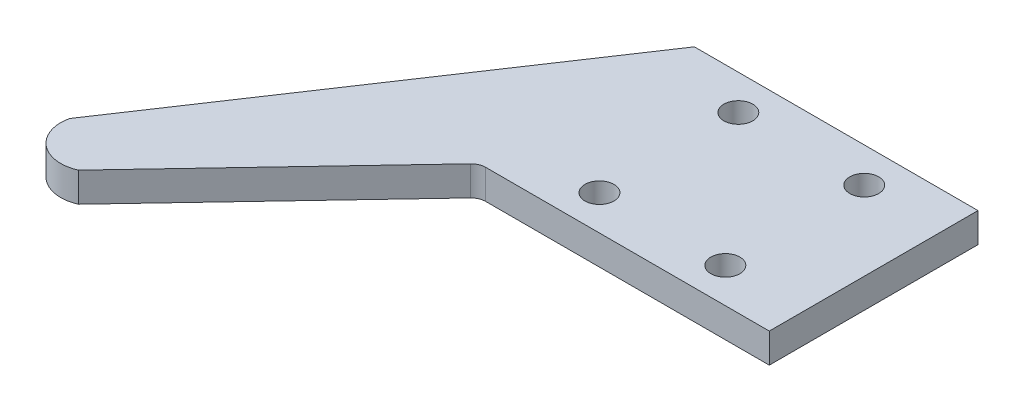
ISO-10303-21;
HEADER;
FILE_DESCRIPTION(('STEP AP214'),'2;1');
FILE_NAME('part.step','',(''),(''),'','','');
FILE_SCHEMA(('AUTOMOTIVE_DESIGN { 1 0 10303 214 1 1 1 1 }'));
ENDSEC;
DATA;
#1=APPLICATION_CONTEXT('core data for automotive mechanical design processes');
#2=APPLICATION_PROTOCOL_DEFINITION('international standard','automotive_design',2000,#1);
#3=PRODUCT_CONTEXT('',#1,'mechanical');
#4=PRODUCT('Part','Part','',(#3));
#5=PRODUCT_RELATED_PRODUCT_CATEGORY('part','',(#4));
#6=PRODUCT_DEFINITION_FORMATION('','',#4);
#7=PRODUCT_DEFINITION_CONTEXT('part definition',#1,'design');
#8=PRODUCT_DEFINITION('design','',#6,#7);
#9=PRODUCT_DEFINITION_SHAPE('','',#8);
#10=(LENGTH_UNIT() NAMED_UNIT(*) SI_UNIT(.MILLI.,.METRE.));
#11=(NAMED_UNIT(*) PLANE_ANGLE_UNIT() SI_UNIT($,.RADIAN.));
#12=(NAMED_UNIT(*) SI_UNIT($,.STERADIAN.) SOLID_ANGLE_UNIT());
#13=UNCERTAINTY_MEASURE_WITH_UNIT(LENGTH_MEASURE(1.E-05),#10,'distance_accuracy_value','');
#14=(GEOMETRIC_REPRESENTATION_CONTEXT(3) GLOBAL_UNCERTAINTY_ASSIGNED_CONTEXT((#13)) GLOBAL_UNIT_ASSIGNED_CONTEXT((#10,
#11,#12)) REPRESENTATION_CONTEXT('',''));
#15=CARTESIAN_POINT('',(0.,0.,0.));
#16=DIRECTION('',(0.,0.,1.));
#17=DIRECTION('',(1.,0.,0.));
#18=AXIS2_PLACEMENT_3D('',#15,#16,#17);
#19=CARTESIAN_POINT('',(29.0805616574897,5.08,41.9679460883035));
#20=DIRECTION('',(0.,-1.,0.));
#21=DIRECTION('',(0.,0.,-1.));
#22=AXIS2_PLACEMENT_3D('',#19,#20,#21);
#23=PLANE('',#22);
#24=CARTESIAN_POINT('',(64.2762166698085,5.08,9.55119608830347));
#25=DIRECTION('',(0.,1.,0.));
#26=DIRECTION('',(0.,0.,1.));
#27=AXIS2_PLACEMENT_3D('',#24,#25,#26);
#28=CIRCLE('',#27,2.48919999999998);
#29=CARTESIAN_POINT('',(64.2762166698085,5.08,12.0403960883035));
#30=VERTEX_POINT('',#29);
#31=EDGE_CURVE('E206',#30,#30,#28,.T.);
#32=ORIENTED_EDGE('',*,*,#31,.F.);
#33=EDGE_LOOP('',(#32));
#34=FACE_BOUND('',#33,.T.);
#35=CARTESIAN_POINT('',(64.2762166698085,5.08,33.4271960883035));
#36=DIRECTION('',(0.,1.,0.));
#37=DIRECTION('',(0.,0.,1.));
#38=AXIS2_PLACEMENT_3D('',#35,#36,#37);
#39=CIRCLE('',#38,2.48919999999998);
#40=CARTESIAN_POINT('',(64.2762166698085,5.08,35.9163960883035));
#41=VERTEX_POINT('',#40);
#42=EDGE_CURVE('E198',#41,#41,#39,.T.);
#43=ORIENTED_EDGE('',*,*,#42,.F.);
#44=EDGE_LOOP('',(#43));
#45=FACE_BOUND('',#44,.T.);
#46=CARTESIAN_POINT('',(29.0805616574897,5.08,41.9679460883035));
#47=DIRECTION('',(0.,-1.,0.));
#48=DIRECTION('',(0.,0.,-1.));
#49=AXIS2_PLACEMENT_3D('',#46,#47,#48);
#50=CIRCLE('',#49,2.54);
#51=CARTESIAN_POINT('',(27.2348076709543,5.08,40.2230127883781));
#52=VERTEX_POINT('',#51);
#53=CARTESIAN_POINT('',(29.0805616574897,5.08,39.4279460883035));
#54=VERTEX_POINT('',#53);
#55=EDGE_CURVE('E160',#52,#54,#50,.T.);
#56=ORIENTED_EDGE('',*,*,#55,.T.);
#57=DIRECTION('',(1.,0.,0.));
#58=VECTOR('',#57,1.);
#59=CARTESIAN_POINT('',(77.8310716821274,5.08,39.4279460883035));
#60=LINE('',#59,#58);
#61=CARTESIAN_POINT('',(77.8310716821274,5.08,39.4279460883035));
#62=VERTEX_POINT('',#61);
#63=EDGE_CURVE('E101',#54,#62,#60,.T.);
#64=ORIENTED_EDGE('',*,*,#63,.T.);
#65=DIRECTION('',(0.,0.,-1.));
#66=VECTOR('',#65,1.);
#67=CARTESIAN_POINT('',(77.8310716821274,5.08,3.55044608830348));
#68=LINE('',#67,#66);
#69=CARTESIAN_POINT('',(77.8310716821274,5.08,3.55044608830348));
#70=VERTEX_POINT('',#69);
#71=EDGE_CURVE('E178',#62,#70,#68,.T.);
#72=ORIENTED_EDGE('',*,*,#71,.T.);
#73=DIRECTION('',(-1.,0.,0.));
#74=VECTOR('',#73,1.);
#75=CARTESIAN_POINT('',(77.8310716821274,5.08,3.55044608830348));
#76=LINE('',#75,#74);
#77=CARTESIAN_POINT('',(29.0805616574897,5.08,3.55044608830346));
#78=VERTEX_POINT('',#77);
#79=EDGE_CURVE('E117',#70,#78,#76,.T.);
#80=ORIENTED_EDGE('',*,*,#79,.T.);
#81=DIRECTION('',(-0.555738142747448,0.,0.831357394082483));
#82=VECTOR('',#81,1.);
#83=CARTESIAN_POINT('',(29.0805616574897,5.08,3.55044608830346));
#84=LINE('',#83,#82);
#85=CARTESIAN_POINT('',(-13.9430810740264,5.08,67.9117356128622));
#86=VERTEX_POINT('',#85);
#87=EDGE_CURVE('E111',#78,#86,#84,.T.);
#88=ORIENTED_EDGE('',*,*,#87,.T.);
#89=CARTESIAN_POINT('',(-8.02603322877602,5.08,69.3087227378112));
#90=DIRECTION('',(0.,1.,0.));
#91=DIRECTION('',(0.,0.,-1.));
#92=AXIS2_PLACEMENT_3D('',#89,#90,#91);
#93=CIRCLE('',#92,6.07972270998076);
#94=CARTESIAN_POINT('',(-5.4826917026468,5.08,74.8309000359177));
#95=VERTEX_POINT('',#94);
#96=EDGE_CURVE('E115',#86,#95,#93,.T.);
#97=ORIENTED_EDGE('',*,*,#96,.T.);
#98=DIRECTION('',(0.686981614143855,0.,-0.7266747978486));
#99=VECTOR('',#98,1.);
#100=CARTESIAN_POINT('',(27.2348076709543,5.08,40.2230127883781));
#101=LINE('',#100,#99);
#102=EDGE_CURVE('E61',#95,#52,#101,.T.);
#103=ORIENTED_EDGE('',*,*,#102,.T.);
#104=EDGE_LOOP('',(#56,#64,#72,#80,#88,#97,#103));
#105=FACE_BOUND('',#104,.T.);
#106=CARTESIAN_POINT('',(42.6354166698085,5.08,9.55119608830348));
#107=DIRECTION('',(0.,1.,0.));
#108=DIRECTION('',(0.,0.,1.));
#109=AXIS2_PLACEMENT_3D('',#106,#107,#108);
#110=CIRCLE('',#109,2.48919999999999);
#111=CARTESIAN_POINT('',(42.6354166698085,5.08,12.0403960883035));
#112=VERTEX_POINT('',#111);
#113=EDGE_CURVE('E214',#112,#112,#110,.T.);
#114=ORIENTED_EDGE('',*,*,#113,.F.);
#115=EDGE_LOOP('',(#114));
#116=FACE_BOUND('',#115,.T.);
#117=CARTESIAN_POINT('',(42.6354166698085,5.08,33.4271960883035));
#118=DIRECTION('',(0.,1.,0.));
#119=DIRECTION('',(0.,0.,1.));
#120=AXIS2_PLACEMENT_3D('',#117,#118,#119);
#121=CIRCLE('',#120,2.48919999999999);
#122=CARTESIAN_POINT('',(42.6354166698085,5.08,35.9163960883035));
#123=VERTEX_POINT('',#122);
#124=EDGE_CURVE('E222',#123,#123,#121,.T.);
#125=ORIENTED_EDGE('',*,*,#124,.F.);
#126=EDGE_LOOP('',(#125));
#127=FACE_BOUND('',#126,.T.);
#128=ADVANCED_FACE('F43',(#34,#45,#105,#116,#127),#23,.F.);
#129=CARTESIAN_POINT('',(29.0805616574897,0.,41.9679460883035));
#130=DIRECTION('',(0.,-1.,0.));
#131=DIRECTION('',(0.,0.,-1.));
#132=AXIS2_PLACEMENT_3D('',#129,#130,#131);
#133=PLANE('',#132);
#134=CARTESIAN_POINT('',(42.6354166698085,0.,9.55119608830348));
#135=DIRECTION('',(0.,1.,0.));
#136=DIRECTION('',(0.,0.,1.));
#137=AXIS2_PLACEMENT_3D('',#134,#135,#136);
#138=CIRCLE('',#137,2.4892);
#139=CARTESIAN_POINT('',(42.6354166698085,0.,12.0403960883035));
#140=VERTEX_POINT('',#139);
#141=EDGE_CURVE('E210',#140,#140,#138,.T.);
#142=ORIENTED_EDGE('',*,*,#141,.T.);
#143=EDGE_LOOP('',(#142));
#144=FACE_BOUND('',#143,.T.);
#145=CARTESIAN_POINT('',(64.2762166698085,0.,9.55119608830347));
#146=DIRECTION('',(0.,1.,0.));
#147=DIRECTION('',(0.,0.,1.));
#148=AXIS2_PLACEMENT_3D('',#145,#146,#147);
#149=CIRCLE('',#148,2.4892);
#150=CARTESIAN_POINT('',(64.2762166698085,0.,12.0403960883035));
#151=VERTEX_POINT('',#150);
#152=EDGE_CURVE('E202',#151,#151,#149,.T.);
#153=ORIENTED_EDGE('',*,*,#152,.T.);
#154=EDGE_LOOP('',(#153));
#155=FACE_BOUND('',#154,.T.);
#156=CARTESIAN_POINT('',(64.2762166698085,0.,33.4271960883035));
#157=DIRECTION('',(0.,1.,0.));
#158=DIRECTION('',(0.,0.,1.));
#159=AXIS2_PLACEMENT_3D('',#156,#157,#158);
#160=CIRCLE('',#159,2.4892);
#161=CARTESIAN_POINT('',(64.2762166698085,0.,35.9163960883035));
#162=VERTEX_POINT('',#161);
#163=EDGE_CURVE('E145',#162,#162,#160,.T.);
#164=ORIENTED_EDGE('',*,*,#163,.T.);
#165=EDGE_LOOP('',(#164));
#166=FACE_BOUND('',#165,.T.);
#167=CARTESIAN_POINT('',(29.0805616574897,0.,41.9679460883035));
#168=DIRECTION('',(0.,-1.,0.));
#169=DIRECTION('',(0.,0.,-1.));
#170=AXIS2_PLACEMENT_3D('',#167,#168,#169);
#171=CIRCLE('',#170,2.54);
#172=CARTESIAN_POINT('',(27.2348076709543,0.,40.2230127883781));
#173=VERTEX_POINT('',#172);
#174=CARTESIAN_POINT('',(29.0805616574897,0.,39.4279460883035));
#175=VERTEX_POINT('',#174);
#176=EDGE_CURVE('E140',#173,#175,#171,.T.);
#177=ORIENTED_EDGE('',*,*,#176,.F.);
#178=DIRECTION('',(0.686981614143855,0.,-0.7266747978486));
#179=VECTOR('',#178,1.);
#180=CARTESIAN_POINT('',(27.2348076709543,0.,40.2230127883781));
#181=LINE('',#180,#179);
#182=CARTESIAN_POINT('',(-5.4826917026468,0.,74.8309000359177));
#183=VERTEX_POINT('',#182);
#184=EDGE_CURVE('E93',#183,#173,#181,.T.);
#185=ORIENTED_EDGE('',*,*,#184,.F.);
#186=CARTESIAN_POINT('',(-8.02603322877602,0.,69.3087227378112));
#187=DIRECTION('',(0.,1.,0.));
#188=DIRECTION('',(0.,0.,-1.));
#189=AXIS2_PLACEMENT_3D('',#186,#187,#188);
#190=CIRCLE('',#189,6.07972270998076);
#191=CARTESIAN_POINT('',(-13.9430810740264,0.,67.9117356128622));
#192=VERTEX_POINT('',#191);
#193=EDGE_CURVE('E87',#192,#183,#190,.T.);
#194=ORIENTED_EDGE('',*,*,#193,.F.);
#195=DIRECTION('',(-0.555738142747448,0.,0.831357394082483));
#196=VECTOR('',#195,1.);
#197=CARTESIAN_POINT('',(29.0805616574897,0.,3.55044608830346));
#198=LINE('',#197,#196);
#199=CARTESIAN_POINT('',(29.0805616574897,0.,3.55044608830346));
#200=VERTEX_POINT('',#199);
#201=EDGE_CURVE('E126',#200,#192,#198,.T.);
#202=ORIENTED_EDGE('',*,*,#201,.F.);
#203=DIRECTION('',(-1.,0.,0.));
#204=VECTOR('',#203,1.);
#205=CARTESIAN_POINT('',(77.8310716821274,0.,3.55044608830348));
#206=LINE('',#205,#204);
#207=CARTESIAN_POINT('',(77.8310716821274,0.,3.55044608830348));
#208=VERTEX_POINT('',#207);
#209=EDGE_CURVE('E151',#208,#200,#206,.T.);
#210=ORIENTED_EDGE('',*,*,#209,.F.);
#211=DIRECTION('',(0.,0.,-1.));
#212=VECTOR('',#211,1.);
#213=CARTESIAN_POINT('',(77.8310716821274,0.,3.55044608830348));
#214=LINE('',#213,#212);
#215=CARTESIAN_POINT('',(77.8310716821274,0.,39.4279460883035));
#216=VERTEX_POINT('',#215);
#217=EDGE_CURVE('E148',#216,#208,#214,.T.);
#218=ORIENTED_EDGE('',*,*,#217,.F.);
#219=DIRECTION('',(1.,0.,0.));
#220=VECTOR('',#219,1.);
#221=CARTESIAN_POINT('',(77.8310716821274,0.,39.4279460883035));
#222=LINE('',#221,#220);
#223=EDGE_CURVE('E144',#175,#216,#222,.T.);
#224=ORIENTED_EDGE('',*,*,#223,.F.);
#225=EDGE_LOOP('',(#177,#185,#194,#202,#210,#218,#224));
#226=FACE_BOUND('',#225,.T.);
#227=CARTESIAN_POINT('',(42.6354166698085,0.,33.4271960883035));
#228=DIRECTION('',(0.,1.,0.));
#229=DIRECTION('',(0.,0.,1.));
#230=AXIS2_PLACEMENT_3D('',#227,#228,#229);
#231=CIRCLE('',#230,2.4892);
#232=CARTESIAN_POINT('',(42.6354166698085,0.,35.9163960883035));
#233=VERTEX_POINT('',#232);
#234=EDGE_CURVE('E218',#233,#233,#231,.T.);
#235=ORIENTED_EDGE('',*,*,#234,.T.);
#236=EDGE_LOOP('',(#235));
#237=FACE_BOUND('',#236,.T.);
#238=ADVANCED_FACE('F182',(#144,#155,#166,#226,#237),#133,.T.);
#239=CARTESIAN_POINT('',(29.0805616574897,5.08,41.9679460883035));
#240=DIRECTION('',(0.,-1.,0.));
#241=DIRECTION('',(0.,0.,-1.));
#242=AXIS2_PLACEMENT_3D('',#239,#240,#241);
#243=CYLINDRICAL_SURFACE('',#242,2.54);
#244=ORIENTED_EDGE('',*,*,#176,.T.);
#245=DIRECTION('',(0.,-1.,0.));
#246=VECTOR('',#245,1.);
#247=CARTESIAN_POINT('',(29.0805616574897,5.08,39.4279460883035));
#248=LINE('',#247,#246);
#249=EDGE_CURVE('E11',#54,#175,#248,.T.);
#250=ORIENTED_EDGE('',*,*,#249,.F.);
#251=ORIENTED_EDGE('',*,*,#55,.F.);
#252=DIRECTION('',(0.,-1.,0.));
#253=VECTOR('',#252,1.);
#254=CARTESIAN_POINT('',(27.2348076709543,5.08,40.2230127883781));
#255=LINE('',#254,#253);
#256=EDGE_CURVE('E136',#52,#173,#255,.T.);
#257=ORIENTED_EDGE('',*,*,#256,.T.);
#258=EDGE_LOOP('',(#244,#250,#251,#257));
#259=FACE_BOUND('',#258,.T.);
#260=ADVANCED_FACE('F45',(#259),#243,.F.);
#261=CARTESIAN_POINT('',(77.8310716821274,5.08,39.4279460883035));
#262=DIRECTION('',(0.,0.,-1.));
#263=DIRECTION('',(-1.,0.,0.));
#264=AXIS2_PLACEMENT_3D('',#261,#262,#263);
#265=PLANE('',#264);
#266=ORIENTED_EDGE('',*,*,#223,.T.);
#267=DIRECTION('',(0.,-1.,0.));
#268=VECTOR('',#267,1.);
#269=CARTESIAN_POINT('',(77.8310716821274,5.08,39.4279460883035));
#270=LINE('',#269,#268);
#271=EDGE_CURVE('E53',#62,#216,#270,.T.);
#272=ORIENTED_EDGE('',*,*,#271,.F.);
#273=ORIENTED_EDGE('',*,*,#63,.F.);
#274=ORIENTED_EDGE('',*,*,#249,.T.);
#275=EDGE_LOOP('',(#266,#272,#273,#274));
#276=FACE_BOUND('',#275,.T.);
#277=ADVANCED_FACE('F254',(#276),#265,.F.);
#278=CARTESIAN_POINT('',(77.8310716821274,5.08,3.55044608830348));
#279=DIRECTION('',(-1.,0.,0.));
#280=DIRECTION('',(0.,0.,1.));
#281=AXIS2_PLACEMENT_3D('',#278,#279,#280);
#282=PLANE('',#281);
#283=ORIENTED_EDGE('',*,*,#217,.T.);
#284=DIRECTION('',(0.,-1.,0.));
#285=VECTOR('',#284,1.);
#286=CARTESIAN_POINT('',(77.8310716821274,5.08,3.55044608830348));
#287=LINE('',#286,#285);
#288=EDGE_CURVE('E167',#70,#208,#287,.T.);
#289=ORIENTED_EDGE('',*,*,#288,.F.);
#290=ORIENTED_EDGE('',*,*,#71,.F.);
#291=ORIENTED_EDGE('',*,*,#271,.T.);
#292=EDGE_LOOP('',(#283,#289,#290,#291));
#293=FACE_BOUND('',#292,.T.);
#294=ADVANCED_FACE('F176',(#293),#282,.F.);
#295=CARTESIAN_POINT('',(77.8310716821274,5.08,3.55044608830348));
#296=DIRECTION('',(0.,0.,1.));
#297=DIRECTION('',(1.,0.,0.));
#298=AXIS2_PLACEMENT_3D('',#295,#296,#297);
#299=PLANE('',#298);
#300=ORIENTED_EDGE('',*,*,#209,.T.);
#301=DIRECTION('',(0.,-1.,0.));
#302=VECTOR('',#301,1.);
#303=CARTESIAN_POINT('',(29.0805616574897,5.08,3.55044608830346));
#304=LINE('',#303,#302);
#305=EDGE_CURVE('E128',#78,#200,#304,.T.);
#306=ORIENTED_EDGE('',*,*,#305,.F.);
#307=ORIENTED_EDGE('',*,*,#79,.F.);
#308=ORIENTED_EDGE('',*,*,#288,.T.);
#309=EDGE_LOOP('',(#300,#306,#307,#308));
#310=FACE_BOUND('',#309,.T.);
#311=ADVANCED_FACE('F185',(#310),#299,.F.);
#312=CARTESIAN_POINT('',(29.0805616574897,5.08,3.55044608830346));
#313=DIRECTION('',(0.831357394082483,0.,0.555738142747448));
#314=DIRECTION('',(0.555738142747448,0.,-0.831357394082483));
#315=AXIS2_PLACEMENT_3D('',#312,#313,#314);
#316=PLANE('',#315);
#317=ORIENTED_EDGE('',*,*,#201,.T.);
#318=DIRECTION('',(0.,-1.,0.));
#319=VECTOR('',#318,1.);
#320=CARTESIAN_POINT('',(-13.9430810740264,5.08,67.9117356128622));
#321=LINE('',#320,#319);
#322=EDGE_CURVE('E123',#86,#192,#321,.T.);
#323=ORIENTED_EDGE('',*,*,#322,.F.);
#324=ORIENTED_EDGE('',*,*,#87,.F.);
#325=ORIENTED_EDGE('',*,*,#305,.T.);
#326=EDGE_LOOP('',(#317,#323,#324,#325));
#327=FACE_BOUND('',#326,.T.);
#328=ADVANCED_FACE('F124',(#327),#316,.F.);
#329=CARTESIAN_POINT('',(-8.02603322877602,5.08,69.3087227378112));
#330=DIRECTION('',(0.,-1.,0.));
#331=DIRECTION('',(0.,0.,-1.));
#332=AXIS2_PLACEMENT_3D('',#329,#330,#331);
#333=CYLINDRICAL_SURFACE('',#332,6.07972270998076);
#334=ORIENTED_EDGE('',*,*,#193,.T.);
#335=DIRECTION('',(0.,-1.,0.));
#336=VECTOR('',#335,1.);
#337=CARTESIAN_POINT('',(-5.4826917026468,5.08,74.8309000359177));
#338=LINE('',#337,#336);
#339=EDGE_CURVE('E129',#95,#183,#338,.T.);
#340=ORIENTED_EDGE('',*,*,#339,.F.);
#341=ORIENTED_EDGE('',*,*,#96,.F.);
#342=ORIENTED_EDGE('',*,*,#322,.T.);
#343=EDGE_LOOP('',(#334,#340,#341,#342));
#344=FACE_BOUND('',#343,.T.);
#345=ADVANCED_FACE('F131',(#344),#333,.T.);
#346=CARTESIAN_POINT('',(27.2348076709543,5.08,40.2230127883781));
#347=DIRECTION('',(-0.7266747978486,0.,-0.686981614143855));
#348=DIRECTION('',(-0.686981614143855,0.,0.7266747978486));
#349=AXIS2_PLACEMENT_3D('',#346,#347,#348);
#350=PLANE('',#349);
#351=ORIENTED_EDGE('',*,*,#184,.T.);
#352=ORIENTED_EDGE('',*,*,#256,.F.);
#353=ORIENTED_EDGE('',*,*,#102,.F.);
#354=ORIENTED_EDGE('',*,*,#339,.T.);
#355=EDGE_LOOP('',(#351,#352,#353,#354));
#356=FACE_BOUND('',#355,.T.);
#357=ADVANCED_FACE('F244',(#356),#350,.F.);
#358=CARTESIAN_POINT('',(64.2762166698085,5.08,33.4271960883035));
#359=DIRECTION('',(0.,1.,0.));
#360=DIRECTION('',(0.,0.,1.));
#361=AXIS2_PLACEMENT_3D('',#358,#359,#360);
#362=CYLINDRICAL_SURFACE('',#361,2.48919999999999);
#363=ORIENTED_EDGE('',*,*,#163,.F.);
#364=EDGE_LOOP('',(#363));
#365=FACE_BOUND('',#364,.T.);
#366=ORIENTED_EDGE('',*,*,#42,.T.);
#367=EDGE_LOOP('',(#366));
#368=FACE_BOUND('',#367,.T.);
#369=ADVANCED_FACE('F241',(#365,#368),#362,.F.);
#370=CARTESIAN_POINT('',(64.2762166698085,5.08,9.55119608830347));
#371=DIRECTION('',(0.,1.,0.));
#372=DIRECTION('',(0.,0.,1.));
#373=AXIS2_PLACEMENT_3D('',#370,#371,#372);
#374=CYLINDRICAL_SURFACE('',#373,2.48919999999999);
#375=ORIENTED_EDGE('',*,*,#152,.F.);
#376=EDGE_LOOP('',(#375));
#377=FACE_BOUND('',#376,.T.);
#378=ORIENTED_EDGE('',*,*,#31,.T.);
#379=EDGE_LOOP('',(#378));
#380=FACE_BOUND('',#379,.T.);
#381=ADVANCED_FACE('F282',(#377,#380),#374,.F.);
#382=CARTESIAN_POINT('',(42.6354166698085,5.08,9.55119608830348));
#383=DIRECTION('',(0.,1.,0.));
#384=DIRECTION('',(0.,0.,1.));
#385=AXIS2_PLACEMENT_3D('',#382,#383,#384);
#386=CYLINDRICAL_SURFACE('',#385,2.48919999999999);
#387=ORIENTED_EDGE('',*,*,#141,.F.);
#388=EDGE_LOOP('',(#387));
#389=FACE_BOUND('',#388,.T.);
#390=ORIENTED_EDGE('',*,*,#113,.T.);
#391=EDGE_LOOP('',(#390));
#392=FACE_BOUND('',#391,.T.);
#393=ADVANCED_FACE('F292',(#389,#392),#386,.F.);
#394=CARTESIAN_POINT('',(42.6354166698085,5.08,33.4271960883035));
#395=DIRECTION('',(0.,1.,0.));
#396=DIRECTION('',(0.,0.,1.));
#397=AXIS2_PLACEMENT_3D('',#394,#395,#396);
#398=CYLINDRICAL_SURFACE('',#397,2.48919999999999);
#399=ORIENTED_EDGE('',*,*,#234,.F.);
#400=EDGE_LOOP('',(#399));
#401=FACE_BOUND('',#400,.T.);
#402=ORIENTED_EDGE('',*,*,#124,.T.);
#403=EDGE_LOOP('',(#402));
#404=FACE_BOUND('',#403,.T.);
#405=ADVANCED_FACE('F228',(#401,#404),#398,.F.);
#406=CLOSED_SHELL('',(#128,#238,#260,#277,#294,#311,#328,#345,#357,#369,#381,#393,#405));
#407=MANIFOLD_SOLID_BREP('B2',#406);
#408=ADVANCED_BREP_SHAPE_REPRESENTATION('',(#18,#407),#14);
#409=SHAPE_DEFINITION_REPRESENTATION(#9,#408);
ENDSEC;
END-ISO-10303-21;
